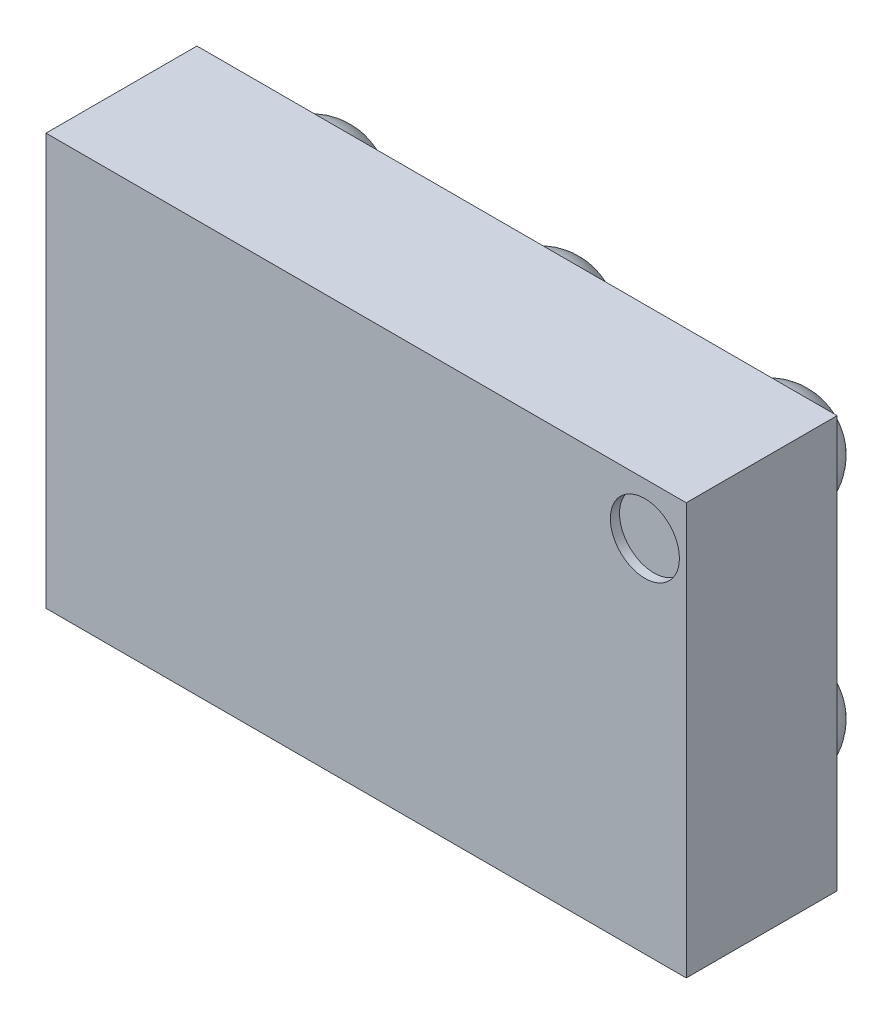
ISO-10303-21;
HEADER;
FILE_DESCRIPTION(('STEP AP214'),'2;1');
FILE_NAME('part.step','',(''),(''),'','','');
FILE_SCHEMA(('AUTOMOTIVE_DESIGN { 1 0 10303 214 1 1 1 1 }'));
ENDSEC;
DATA;
#1=APPLICATION_CONTEXT('core data for automotive mechanical design processes');
#2=APPLICATION_PROTOCOL_DEFINITION('international standard','automotive_design',2000,#1);
#3=PRODUCT_CONTEXT('',#1,'mechanical');
#4=PRODUCT('Part','Part','',(#3));
#5=PRODUCT_RELATED_PRODUCT_CATEGORY('part','',(#4));
#6=PRODUCT_DEFINITION_FORMATION('','',#4);
#7=PRODUCT_DEFINITION_CONTEXT('part definition',#1,'design');
#8=PRODUCT_DEFINITION('design','',#6,#7);
#9=PRODUCT_DEFINITION_SHAPE('','',#8);
#10=(LENGTH_UNIT() NAMED_UNIT(*) SI_UNIT(.MILLI.,.METRE.));
#11=(NAMED_UNIT(*) PLANE_ANGLE_UNIT() SI_UNIT($,.RADIAN.));
#12=(NAMED_UNIT(*) SI_UNIT($,.STERADIAN.) SOLID_ANGLE_UNIT());
#13=UNCERTAINTY_MEASURE_WITH_UNIT(LENGTH_MEASURE(1.E-05),#10,'distance_accuracy_value','');
#14=(GEOMETRIC_REPRESENTATION_CONTEXT(3) GLOBAL_UNCERTAINTY_ASSIGNED_CONTEXT((#13)) GLOBAL_UNIT_ASSIGNED_CONTEXT((#10,
#11,#12)) REPRESENTATION_CONTEXT('',''));
#15=CARTESIAN_POINT('',(0.,0.,0.));
#16=DIRECTION('',(0.,0.,1.));
#17=DIRECTION('',(1.,0.,0.));
#18=AXIS2_PLACEMENT_3D('',#15,#16,#17);
#19=CARTESIAN_POINT('',(0.7,-0.45,0.5));
#20=DIRECTION('',(-1.,0.,0.));
#21=DIRECTION('',(0.,0.,1.));
#22=AXIS2_PLACEMENT_3D('',#19,#20,#21);
#23=PLANE('',#22);
#24=DIRECTION('',(0.,1.,0.));
#25=VECTOR('',#24,1.);
#26=CARTESIAN_POINT('',(0.7,-0.45,0.17));
#27=LINE('',#26,#25);
#28=CARTESIAN_POINT('',(0.7,-0.45,0.17));
#29=VERTEX_POINT('',#28);
#30=CARTESIAN_POINT('',(0.7,0.45,0.17));
#31=VERTEX_POINT('',#30);
#32=EDGE_CURVE('E113',#29,#31,#27,.T.);
#33=ORIENTED_EDGE('',*,*,#32,.T.);
#34=DIRECTION('',(0.,0.,-1.));
#35=VECTOR('',#34,1.);
#36=CARTESIAN_POINT('',(0.7,0.45,0.5));
#37=LINE('',#36,#35);
#38=CARTESIAN_POINT('',(0.7,0.45,0.5));
#39=VERTEX_POINT('',#38);
#40=EDGE_CURVE('E102',#39,#31,#37,.T.);
#41=ORIENTED_EDGE('',*,*,#40,.F.);
#42=DIRECTION('',(0.,1.,0.));
#43=VECTOR('',#42,1.);
#44=CARTESIAN_POINT('',(0.7,-0.45,0.5));
#45=LINE('',#44,#43);
#46=CARTESIAN_POINT('',(0.7,-0.45,0.5));
#47=VERTEX_POINT('',#46);
#48=EDGE_CURVE('E94',#47,#39,#45,.T.);
#49=ORIENTED_EDGE('',*,*,#48,.F.);
#50=DIRECTION('',(0.,0.,-1.));
#51=VECTOR('',#50,1.);
#52=CARTESIAN_POINT('',(0.7,-0.45,0.5));
#53=LINE('',#52,#51);
#54=EDGE_CURVE('E109',#47,#29,#53,.T.);
#55=ORIENTED_EDGE('',*,*,#54,.T.);
#56=EDGE_LOOP('',(#33,#41,#49,#55));
#57=FACE_BOUND('',#56,.T.);
#58=ADVANCED_FACE('F41',(#57),#23,.F.);
#59=CARTESIAN_POINT('',(-0.7,0.45,0.5));
#60=DIRECTION('',(0.,-1.,0.));
#61=DIRECTION('',(0.,0.,-1.));
#62=AXIS2_PLACEMENT_3D('',#59,#60,#61);
#63=PLANE('',#62);
#64=DIRECTION('',(-1.,0.,0.));
#65=VECTOR('',#64,1.);
#66=CARTESIAN_POINT('',(-0.7,0.45,0.17));
#67=LINE('',#66,#65);
#68=CARTESIAN_POINT('',(-0.7,0.45,0.17));
#69=VERTEX_POINT('',#68);
#70=EDGE_CURVE('E100',#31,#69,#67,.T.);
#71=ORIENTED_EDGE('',*,*,#70,.T.);
#72=DIRECTION('',(0.,0.,-1.));
#73=VECTOR('',#72,1.);
#74=CARTESIAN_POINT('',(-0.7,0.45,0.5));
#75=LINE('',#74,#73);
#76=CARTESIAN_POINT('',(-0.7,0.45,0.5));
#77=VERTEX_POINT('',#76);
#78=EDGE_CURVE('E98',#77,#69,#75,.T.);
#79=ORIENTED_EDGE('',*,*,#78,.F.);
#80=DIRECTION('',(-1.,0.,0.));
#81=VECTOR('',#80,1.);
#82=CARTESIAN_POINT('',(-0.7,0.45,0.5));
#83=LINE('',#82,#81);
#84=EDGE_CURVE('E89',#39,#77,#83,.T.);
#85=ORIENTED_EDGE('',*,*,#84,.F.);
#86=ORIENTED_EDGE('',*,*,#40,.T.);
#87=EDGE_LOOP('',(#71,#79,#85,#86));
#88=FACE_BOUND('',#87,.T.);
#89=ADVANCED_FACE('F99',(#88),#63,.F.);
#90=CARTESIAN_POINT('',(-0.7,-0.45,0.5));
#91=DIRECTION('',(1.,0.,0.));
#92=DIRECTION('',(0.,0.,-1.));
#93=AXIS2_PLACEMENT_3D('',#90,#91,#92);
#94=PLANE('',#93);
#95=DIRECTION('',(0.,-1.,0.));
#96=VECTOR('',#95,1.);
#97=CARTESIAN_POINT('',(-0.7,-0.45,0.17));
#98=LINE('',#97,#96);
#99=CARTESIAN_POINT('',(-0.7,-0.45,0.17));
#100=VERTEX_POINT('',#99);
#101=EDGE_CURVE('E75',#69,#100,#98,.T.);
#102=ORIENTED_EDGE('',*,*,#101,.T.);
#103=DIRECTION('',(0.,0.,-1.));
#104=VECTOR('',#103,1.);
#105=CARTESIAN_POINT('',(-0.7,-0.45,0.5));
#106=LINE('',#105,#104);
#107=CARTESIAN_POINT('',(-0.7,-0.45,0.5));
#108=VERTEX_POINT('',#107);
#109=EDGE_CURVE('E103',#108,#100,#106,.T.);
#110=ORIENTED_EDGE('',*,*,#109,.F.);
#111=DIRECTION('',(0.,-1.,0.));
#112=VECTOR('',#111,1.);
#113=CARTESIAN_POINT('',(-0.7,-0.45,0.5));
#114=LINE('',#113,#112);
#115=EDGE_CURVE('E92',#77,#108,#114,.T.);
#116=ORIENTED_EDGE('',*,*,#115,.F.);
#117=ORIENTED_EDGE('',*,*,#78,.T.);
#118=EDGE_LOOP('',(#102,#110,#116,#117));
#119=FACE_BOUND('',#118,.T.);
#120=ADVANCED_FACE('F105',(#119),#94,.F.);
#121=CARTESIAN_POINT('',(-0.7,-0.45,0.5));
#122=DIRECTION('',(0.,1.,0.));
#123=DIRECTION('',(0.,0.,1.));
#124=AXIS2_PLACEMENT_3D('',#121,#122,#123);
#125=PLANE('',#124);
#126=DIRECTION('',(1.,0.,0.));
#127=VECTOR('',#126,1.);
#128=CARTESIAN_POINT('',(-0.7,-0.45,0.17));
#129=LINE('',#128,#127);
#130=EDGE_CURVE('E81',#100,#29,#129,.T.);
#131=ORIENTED_EDGE('',*,*,#130,.T.);
#132=ORIENTED_EDGE('',*,*,#54,.F.);
#133=DIRECTION('',(1.,0.,0.));
#134=VECTOR('',#133,1.);
#135=CARTESIAN_POINT('',(-0.7,-0.45,0.5));
#136=LINE('',#135,#134);
#137=EDGE_CURVE('E58',#108,#47,#136,.T.);
#138=ORIENTED_EDGE('',*,*,#137,.F.);
#139=ORIENTED_EDGE('',*,*,#109,.T.);
#140=EDGE_LOOP('',(#131,#132,#138,#139));
#141=FACE_BOUND('',#140,.T.);
#142=ADVANCED_FACE('F167',(#141),#125,.F.);
#143=CARTESIAN_POINT('',(0.,0.,0.5));
#144=DIRECTION('',(0.,0.,-1.));
#145=DIRECTION('',(-1.,0.,0.));
#146=AXIS2_PLACEMENT_3D('',#143,#144,#145);
#147=PLANE('',#146);
#148=CARTESIAN_POINT('',(0.609536705304947,0.33716306108289,0.5));
#149=DIRECTION('',(0.,0.,1.));
#150=DIRECTION('',(1.,0.,0.));
#151=AXIS2_PLACEMENT_3D('',#148,#149,#150);
#152=CIRCLE('',#151,0.0754987073320995);
#153=CARTESIAN_POINT('',(0.685035412637047,0.33716306108289,0.5));
#154=VERTEX_POINT('',#153);
#155=EDGE_CURVE('E292',#154,#154,#152,.T.);
#156=ORIENTED_EDGE('',*,*,#155,.F.);
#157=EDGE_LOOP('',(#156));
#158=FACE_BOUND('',#157,.T.);
#159=ORIENTED_EDGE('',*,*,#48,.T.);
#160=ORIENTED_EDGE('',*,*,#84,.T.);
#161=ORIENTED_EDGE('',*,*,#115,.T.);
#162=ORIENTED_EDGE('',*,*,#137,.T.);
#163=EDGE_LOOP('',(#159,#160,#161,#162));
#164=FACE_BOUND('',#163,.T.);
#165=ADVANCED_FACE('F90',(#158,#164),#147,.F.);
#166=CARTESIAN_POINT('',(0.,0.,0.17));
#167=DIRECTION('',(0.,0.,-1.));
#168=DIRECTION('',(-1.,0.,0.));
#169=AXIS2_PLACEMENT_3D('',#166,#167,#168);
#170=PLANE('',#169);
#171=CARTESIAN_POINT('',(0.5,-0.25,0.17));
#172=DIRECTION('',(0.,0.,-1.));
#173=DIRECTION('',(-1.,0.,0.));
#174=AXIS2_PLACEMENT_3D('',#171,#172,#173);
#175=CIRCLE('',#174,0.109087121146357);
#176=CARTESIAN_POINT('',(0.390912878853643,-0.25,0.17));
#177=VERTEX_POINT('',#176);
#178=EDGE_CURVE('E11',#177,#177,#175,.T.);
#179=ORIENTED_EDGE('',*,*,#178,.F.);
#180=EDGE_LOOP('',(#179));
#181=FACE_BOUND('',#180,.T.);
#182=CARTESIAN_POINT('',(0.5,0.25,0.17));
#183=DIRECTION('',(0.,0.,-1.));
#184=DIRECTION('',(-1.,0.,0.));
#185=AXIS2_PLACEMENT_3D('',#182,#183,#184);
#186=CIRCLE('',#185,0.109087121146357);
#187=CARTESIAN_POINT('',(0.390912878853643,0.25,0.17));
#188=VERTEX_POINT('',#187);
#189=EDGE_CURVE('E50',#188,#188,#186,.T.);
#190=ORIENTED_EDGE('',*,*,#189,.F.);
#191=EDGE_LOOP('',(#190));
#192=FACE_BOUND('',#191,.T.);
#193=CARTESIAN_POINT('',(0.,-0.25,0.17));
#194=DIRECTION('',(0.,0.,-1.));
#195=DIRECTION('',(-1.,0.,0.));
#196=AXIS2_PLACEMENT_3D('',#193,#194,#195);
#197=CIRCLE('',#196,0.109087121146357);
#198=CARTESIAN_POINT('',(-0.109087121146357,-0.25,0.17));
#199=VERTEX_POINT('',#198);
#200=EDGE_CURVE('E142',#199,#199,#197,.T.);
#201=ORIENTED_EDGE('',*,*,#200,.F.);
#202=EDGE_LOOP('',(#201));
#203=FACE_BOUND('',#202,.T.);
#204=CARTESIAN_POINT('',(0.,0.25,0.17));
#205=DIRECTION('',(0.,0.,-1.));
#206=DIRECTION('',(-1.,0.,0.));
#207=AXIS2_PLACEMENT_3D('',#204,#205,#206);
#208=CIRCLE('',#207,0.109087121146357);
#209=CARTESIAN_POINT('',(-0.109087121146357,0.25,0.17));
#210=VERTEX_POINT('',#209);
#211=EDGE_CURVE('E138',#210,#210,#208,.T.);
#212=ORIENTED_EDGE('',*,*,#211,.F.);
#213=EDGE_LOOP('',(#212));
#214=FACE_BOUND('',#213,.T.);
#215=CARTESIAN_POINT('',(-0.5,-0.25,0.17));
#216=DIRECTION('',(0.,0.,-1.));
#217=DIRECTION('',(-1.,0.,0.));
#218=AXIS2_PLACEMENT_3D('',#215,#216,#217);
#219=CIRCLE('',#218,0.109087121146357);
#220=CARTESIAN_POINT('',(-0.609087121146357,-0.25,0.17));
#221=VERTEX_POINT('',#220);
#222=EDGE_CURVE('E134',#221,#221,#219,.T.);
#223=ORIENTED_EDGE('',*,*,#222,.F.);
#224=EDGE_LOOP('',(#223));
#225=FACE_BOUND('',#224,.T.);
#226=CARTESIAN_POINT('',(-0.5,0.25,0.17));
#227=DIRECTION('',(0.,0.,-1.));
#228=DIRECTION('',(-1.,0.,0.));
#229=AXIS2_PLACEMENT_3D('',#226,#227,#228);
#230=CIRCLE('',#229,0.109087121146357);
#231=CARTESIAN_POINT('',(-0.609087121146357,0.25,0.17));
#232=VERTEX_POINT('',#231);
#233=EDGE_CURVE('E130',#232,#232,#230,.T.);
#234=ORIENTED_EDGE('',*,*,#233,.F.);
#235=EDGE_LOOP('',(#234));
#236=FACE_BOUND('',#235,.T.);
#237=ORIENTED_EDGE('',*,*,#32,.F.);
#238=ORIENTED_EDGE('',*,*,#130,.F.);
#239=ORIENTED_EDGE('',*,*,#101,.F.);
#240=ORIENTED_EDGE('',*,*,#70,.F.);
#241=EDGE_LOOP('',(#237,#238,#239,#240));
#242=FACE_BOUND('',#241,.T.);
#243=ADVANCED_FACE('F151',(#181,#192,#203,#214,#225,#236,#242),#170,.T.);
#244=CARTESIAN_POINT('',(-0.5,0.25,0.12));
#245=DIRECTION('',(0.,0.,-1.));
#246=DIRECTION('',(-1.,0.,0.));
#247=AXIS2_PLACEMENT_3D('',#244,#245,#246);
#248=SPHERICAL_SURFACE('',#247,0.12);
#249=ORIENTED_EDGE('',*,*,#233,.T.);
#250=EDGE_LOOP('',(#249));
#251=FACE_BOUND('',#250,.T.);
#252=ADVANCED_FACE('F154',(#251),#248,.T.);
#253=CARTESIAN_POINT('',(-0.5,-0.25,0.12));
#254=DIRECTION('',(0.,0.,-1.));
#255=DIRECTION('',(-1.,0.,0.));
#256=AXIS2_PLACEMENT_3D('',#253,#254,#255);
#257=SPHERICAL_SURFACE('',#256,0.12);
#258=ORIENTED_EDGE('',*,*,#222,.T.);
#259=EDGE_LOOP('',(#258));
#260=FACE_BOUND('',#259,.T.);
#261=ADVANCED_FACE('F201',(#260),#257,.T.);
#262=CARTESIAN_POINT('',(0.,0.25,0.12));
#263=DIRECTION('',(0.,0.,-1.));
#264=DIRECTION('',(-1.,0.,0.));
#265=AXIS2_PLACEMENT_3D('',#262,#263,#264);
#266=SPHERICAL_SURFACE('',#265,0.12);
#267=ORIENTED_EDGE('',*,*,#211,.T.);
#268=EDGE_LOOP('',(#267));
#269=FACE_BOUND('',#268,.T.);
#270=ADVANCED_FACE('F218',(#269),#266,.T.);
#271=CARTESIAN_POINT('',(0.,-0.25,0.12));
#272=DIRECTION('',(0.,0.,-1.));
#273=DIRECTION('',(-1.,0.,0.));
#274=AXIS2_PLACEMENT_3D('',#271,#272,#273);
#275=SPHERICAL_SURFACE('',#274,0.12);
#276=ORIENTED_EDGE('',*,*,#200,.T.);
#277=EDGE_LOOP('',(#276));
#278=FACE_BOUND('',#277,.T.);
#279=ADVANCED_FACE('F230',(#278),#275,.T.);
#280=CARTESIAN_POINT('',(0.5,0.25,0.12));
#281=DIRECTION('',(0.,0.,-1.));
#282=DIRECTION('',(-1.,0.,0.));
#283=AXIS2_PLACEMENT_3D('',#280,#281,#282);
#284=SPHERICAL_SURFACE('',#283,0.12);
#285=ORIENTED_EDGE('',*,*,#189,.T.);
#286=EDGE_LOOP('',(#285));
#287=FACE_BOUND('',#286,.T.);
#288=ADVANCED_FACE('F149',(#287),#284,.T.);
#289=CARTESIAN_POINT('',(0.5,-0.25,0.12));
#290=DIRECTION('',(0.,0.,-1.));
#291=DIRECTION('',(-1.,0.,0.));
#292=AXIS2_PLACEMENT_3D('',#289,#290,#291);
#293=SPHERICAL_SURFACE('',#292,0.12);
#294=ORIENTED_EDGE('',*,*,#178,.T.);
#295=EDGE_LOOP('',(#294));
#296=FACE_BOUND('',#295,.T.);
#297=ADVANCED_FACE('F251',(#296),#293,.T.);
#298=CARTESIAN_POINT('',(0.609536705304947,0.33716306108289,0.48));
#299=DIRECTION('',(0.,0.,1.));
#300=DIRECTION('',(1.,0.,0.));
#301=AXIS2_PLACEMENT_3D('',#298,#299,#300);
#302=CYLINDRICAL_SURFACE('',#301,0.0754987073320995);
#303=CARTESIAN_POINT('',(0.609536705304947,0.33716306108289,0.48));
#304=DIRECTION('',(0.,0.,1.));
#305=DIRECTION('',(1.,0.,0.));
#306=AXIS2_PLACEMENT_3D('',#303,#304,#305);
#307=CIRCLE('',#306,0.0754987073320995);
#308=CARTESIAN_POINT('',(0.685035412637047,0.33716306108289,0.48));
#309=VERTEX_POINT('',#308);
#310=EDGE_CURVE('E117',#309,#309,#307,.T.);
#311=ORIENTED_EDGE('',*,*,#310,.F.);
#312=EDGE_LOOP('',(#311));
#313=FACE_BOUND('',#312,.T.);
#314=ORIENTED_EDGE('',*,*,#155,.T.);
#315=EDGE_LOOP('',(#314));
#316=FACE_BOUND('',#315,.T.);
#317=ADVANCED_FACE('F260',(#313,#316),#302,.F.);
#318=CARTESIAN_POINT('',(0.609536705304947,0.33716306108289,0.48));
#319=DIRECTION('',(0.,0.,1.));
#320=DIRECTION('',(1.,0.,0.));
#321=AXIS2_PLACEMENT_3D('',#318,#319,#320);
#322=PLANE('',#321);
#323=ORIENTED_EDGE('',*,*,#310,.T.);
#324=EDGE_LOOP('',(#323));
#325=FACE_BOUND('',#324,.T.);
#326=ADVANCED_FACE('F275',(#325),#322,.T.);
#327=CLOSED_SHELL('',(#58,#89,#120,#142,#165,#243,#252,#261,#270,#279,#288,#297,#317,#326));
#328=MANIFOLD_SOLID_BREP('B2',#327);
#329=ADVANCED_BREP_SHAPE_REPRESENTATION('',(#18,#328),#14);
#330=SHAPE_DEFINITION_REPRESENTATION(#9,#329);
ENDSEC;
END-ISO-10303-21;
